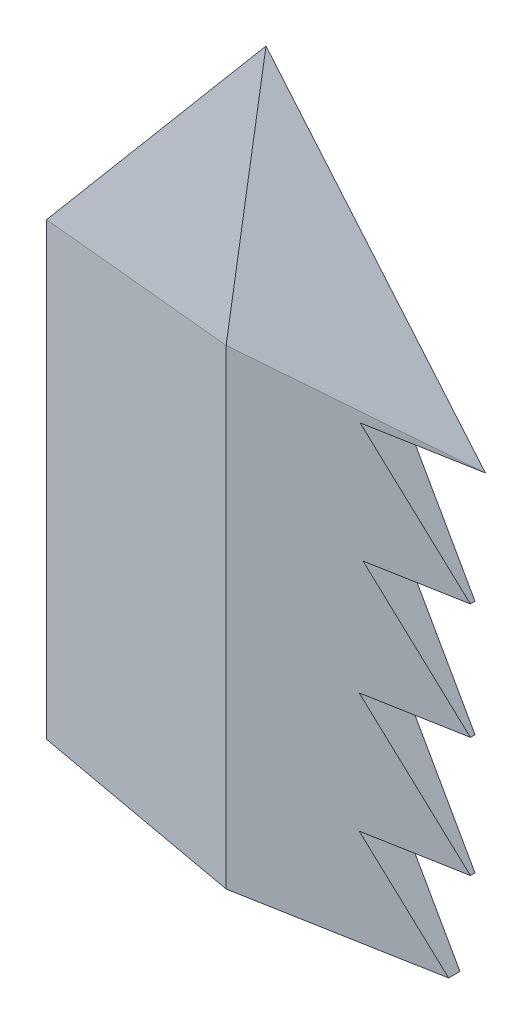
ISO-10303-21;
HEADER;
FILE_DESCRIPTION(('STEP AP214'),'2;1');
FILE_NAME('part.step','',(''),(''),'','','');
FILE_SCHEMA(('AUTOMOTIVE_DESIGN { 1 0 10303 214 1 1 1 1 }'));
ENDSEC;
DATA;
#1=APPLICATION_CONTEXT('core data for automotive mechanical design processes');
#2=APPLICATION_PROTOCOL_DEFINITION('international standard','automotive_design',2000,#1);
#3=PRODUCT_CONTEXT('',#1,'mechanical');
#4=PRODUCT('Part','Part','',(#3));
#5=PRODUCT_RELATED_PRODUCT_CATEGORY('part','',(#4));
#6=PRODUCT_DEFINITION_FORMATION('','',#4);
#7=PRODUCT_DEFINITION_CONTEXT('part definition',#1,'design');
#8=PRODUCT_DEFINITION('design','',#6,#7);
#9=PRODUCT_DEFINITION_SHAPE('','',#8);
#10=(LENGTH_UNIT() NAMED_UNIT(*) SI_UNIT(.MILLI.,.METRE.));
#11=(NAMED_UNIT(*) PLANE_ANGLE_UNIT() SI_UNIT($,.RADIAN.));
#12=(NAMED_UNIT(*) SI_UNIT($,.STERADIAN.) SOLID_ANGLE_UNIT());
#13=UNCERTAINTY_MEASURE_WITH_UNIT(LENGTH_MEASURE(1.E-05),#10,'distance_accuracy_value','');
#14=(GEOMETRIC_REPRESENTATION_CONTEXT(3) GLOBAL_UNCERTAINTY_ASSIGNED_CONTEXT((#13)) GLOBAL_UNIT_ASSIGNED_CONTEXT((#10,
#11,#12)) REPRESENTATION_CONTEXT('',''));
#15=CARTESIAN_POINT('',(0.,0.,0.));
#16=DIRECTION('',(0.,0.,1.));
#17=DIRECTION('',(1.,0.,0.));
#18=AXIS2_PLACEMENT_3D('',#15,#16,#17);
#19=CARTESIAN_POINT('',(49.4049114425268,735.656458749055,0.));
#20=DIRECTION('',(0.178885438199983,0.,0.983869910099907));
#21=DIRECTION('',(0.983869910099907,0.,-0.178885438199983));
#22=AXIS2_PLACEMENT_3D('',#19,#20,#21);
#23=PLANE('',#22);
#24=DIRECTION('',(0.983869910099908,0.,-0.178885438199983));
#25=VECTOR('',#24,1.);
#26=CARTESIAN_POINT('',(49.4049114425268,566.076912382089,0.));
#27=LINE('',#26,#25);
#28=CARTESIAN_POINT('',(49.4049114425268,566.076912382089,0.));
#29=VERTEX_POINT('',#28);
#30=CARTESIAN_POINT('',(101.792411442527,566.076912382089,-9.525));
#31=VERTEX_POINT('',#30);
#32=EDGE_CURVE('E141',#29,#31,#27,.T.);
#33=ORIENTED_EDGE('',*,*,#32,.F.);
#34=DIRECTION('',(0.,-1.,0.));
#35=VECTOR('',#34,1.);
#36=CARTESIAN_POINT('',(49.4049114425268,735.656458749055,0.));
#37=LINE('',#36,#35);
#38=CARTESIAN_POINT('',(49.4049114425268,673.557276223925,0.));
#39=VERTEX_POINT('',#38);
#40=EDGE_CURVE('E139',#39,#29,#37,.T.);
#41=ORIENTED_EDGE('',*,*,#40,.F.);
#42=DIRECTION('',(0.979647196162133,0.0925498026063238,-0.178117672029479));
#43=VECTOR('',#42,1.);
#44=CARTESIAN_POINT('',(55.0352055276626,674.089184658141,-1.02368983366106));
#45=LINE('',#44,#43);
#46=CARTESIAN_POINT('',(101.792411442527,678.506458749055,-9.52499999999999));
#47=VERTEX_POINT('',#46);
#48=EDGE_CURVE('E264',#39,#47,#45,.T.);
#49=ORIENTED_EDGE('',*,*,#48,.T.);
#50=DIRECTION('',(0.,-1.,0.));
#51=VECTOR('',#50,1.);
#52=CARTESIAN_POINT('',(101.792411442527,735.656458749055,-9.525));
#53=LINE('',#52,#51);
#54=EDGE_CURVE('E205',#47,#31,#53,.T.);
#55=ORIENTED_EDGE('',*,*,#54,.T.);
#56=EDGE_LOOP('',(#33,#41,#49,#55));
#57=FACE_BOUND('',#56,.T.);
#58=ADVANCED_FACE('F33',(#57),#23,.F.);
#59=CARTESIAN_POINT('',(101.792411442527,735.656458749055,-9.525));
#60=DIRECTION('',(-0.178885438199983,0.,0.983869910099907));
#61=DIRECTION('',(0.983869910099907,0.,0.178885438199983));
#62=AXIS2_PLACEMENT_3D('',#59,#60,#61);
#63=PLANE('',#62);
#64=DIRECTION('',(0.983869910099908,0.,0.178885438199983));
#65=VECTOR('',#64,1.);
#66=CARTESIAN_POINT('',(101.792411442527,566.076912382089,-9.525));
#67=LINE('',#66,#65);
#68=CARTESIAN_POINT('',(146.757210095391,566.076912382089,-1.34958206311564));
#69=VERTEX_POINT('',#68);
#70=EDGE_CURVE('E49',#31,#69,#67,.T.);
#71=ORIENTED_EDGE('',*,*,#70,.F.);
#72=ORIENTED_EDGE('',*,*,#54,.F.);
#73=DIRECTION('',(-0.979647196162133,0.092549802606325,-0.178117672029479));
#74=VECTOR('',#73,1.);
#75=CARTESIAN_POINT('',(96.6108407054998,678.995975128811,-10.4671037703685));
#76=LINE('',#75,#74);
#77=CARTESIAN_POINT('',(154.179911442527,673.557276223925,0.));
#78=VERTEX_POINT('',#77);
#79=EDGE_CURVE('E229',#78,#47,#76,.T.);
#80=ORIENTED_EDGE('',*,*,#79,.F.);
#81=DIRECTION('',(-0.983869910099908,0.,-0.178885438199983));
#82=VECTOR('',#81,1.);
#83=CARTESIAN_POINT('',(152.503511442527,673.557276223924,-0.304799999999994));
#84=LINE('',#83,#82);
#85=CARTESIAN_POINT('',(128.876006432521,673.557276223924,-4.60071000181918));
#86=VERTEX_POINT('',#85);
#87=EDGE_CURVE('E152',#78,#86,#84,.T.);
#88=ORIENTED_EDGE('',*,*,#87,.T.);
#89=DIRECTION('',(0.614220244823665,-0.781192595146374,0.111676408149757));
#90=VECTOR('',#89,1.);
#91=CARTESIAN_POINT('',(128.538230123855,673.986875139573,-4.66212387612206));
#92=LINE('',#91,#90);
#93=CARTESIAN_POINT('',(151.148766449185,645.229790529464,-0.551117271516697));
#94=VERTEX_POINT('',#93);
#95=EDGE_CURVE('E224',#86,#94,#92,.T.);
#96=ORIENTED_EDGE('',*,*,#95,.T.);
#97=DIRECTION('',(-0.983869910099908,0.,-0.178885438199983));
#98=VECTOR('',#97,1.);
#99=CARTESIAN_POINT('',(149.569363088972,645.229790529464,-0.838281518828162));
#100=LINE('',#99,#98);
#101=CARTESIAN_POINT('',(129.452026088125,645.229790529464,-4.49597915534583));
#102=VERTEX_POINT('',#101);
#103=EDGE_CURVE('E223',#94,#102,#100,.T.);
#104=ORIENTED_EDGE('',*,*,#103,.T.);
#105=DIRECTION('',(0.614220244823665,-0.781192595146374,0.111676408149757));
#106=VECTOR('',#105,1.);
#107=CARTESIAN_POINT('',(129.107065881123,645.668526246174,-4.55869919298257));
#108=LINE('',#107,#106);
#109=CARTESIAN_POINT('',(151.148766449185,617.634912223655,-0.551117271516697));
#110=VERTEX_POINT('',#109);
#111=EDGE_CURVE('E221',#102,#110,#108,.T.);
#112=ORIENTED_EDGE('',*,*,#111,.T.);
#113=DIRECTION('',(-0.983869910099908,0.,-0.178885438199983));
#114=VECTOR('',#113,1.);
#115=CARTESIAN_POINT('',(149.569363088972,617.634912223655,-0.838281518828162));
#116=LINE('',#115,#114);
#117=CARTESIAN_POINT('',(128.683999880654,617.634912223655,-4.63562028397697));
#118=VERTEX_POINT('',#117);
#119=EDGE_CURVE('E219',#110,#118,#116,.T.);
#120=ORIENTED_EDGE('',*,*,#119,.T.);
#121=DIRECTION('',(0.614220244823665,-0.781192595146374,0.111676408149757));
#122=VECTOR('',#121,1.);
#123=CARTESIAN_POINT('',(128.348618204766,618.06146553895,-4.69659877050188));
#124=LINE('',#123,#122);
#125=CARTESIAN_POINT('',(151.148766449185,589.063224066312,-0.551117271516697));
#126=VERTEX_POINT('',#125);
#127=EDGE_CURVE('E217',#118,#126,#124,.T.);
#128=ORIENTED_EDGE('',*,*,#127,.T.);
#129=DIRECTION('',(-0.983869910099908,0.,-0.178885438199983));
#130=VECTOR('',#129,1.);
#131=CARTESIAN_POINT('',(149.569363088972,589.063224066312,-0.838281518828162));
#132=LINE('',#131,#130);
#133=CARTESIAN_POINT('',(128.683999880654,589.063224066312,-4.63562028397697));
#134=VERTEX_POINT('',#133);
#135=EDGE_CURVE('E215',#126,#134,#132,.T.);
#136=ORIENTED_EDGE('',*,*,#135,.T.);
#137=DIRECTION('',(0.614220244823665,-0.781192595146374,0.111676408149757));
#138=VECTOR('',#137,1.);
#139=CARTESIAN_POINT('',(128.348618204766,589.489777381607,-4.69659877050188));
#140=LINE('',#139,#138);
#141=EDGE_CURVE('E208',#134,#69,#140,.T.);
#142=ORIENTED_EDGE('',*,*,#141,.T.);
#143=EDGE_LOOP('',(#71,#72,#80,#88,#96,#104,#112,#120,#128,#136,#142));
#144=FACE_BOUND('',#143,.T.);
#145=ADVANCED_FACE('F227',(#144),#63,.F.);
#146=CARTESIAN_POINT('',(101.792411442527,735.656458749055,9.525));
#147=DIRECTION('',(-0.178885438199983,0.,-0.983869910099907));
#148=DIRECTION('',(-0.983869910099907,0.,0.178885438199983));
#149=AXIS2_PLACEMENT_3D('',#146,#147,#148);
#150=PLANE('',#149);
#151=DIRECTION('',(-0.983869910099908,0.,0.178885438199983));
#152=VECTOR('',#151,1.);
#153=CARTESIAN_POINT('',(101.792411442527,566.076912382089,9.525));
#154=LINE('',#153,#152);
#155=CARTESIAN_POINT('',(146.757210095391,566.076912382089,1.34958206311564));
#156=VERTEX_POINT('',#155);
#157=CARTESIAN_POINT('',(101.792411442527,566.076912382089,9.525));
#158=VERTEX_POINT('',#157);
#159=EDGE_CURVE('E122',#156,#158,#154,.T.);
#160=ORIENTED_EDGE('',*,*,#159,.F.);
#161=DIRECTION('',(-0.614220244823665,0.781192595146374,0.111676408149757));
#162=VECTOR('',#161,1.);
#163=CARTESIAN_POINT('',(129.655332204645,587.827840463568,4.45901440688762));
#164=LINE('',#163,#162);
#165=CARTESIAN_POINT('',(128.683999880654,589.063224066312,4.63562028397696));
#166=VERTEX_POINT('',#165);
#167=EDGE_CURVE('E148',#156,#166,#164,.T.);
#168=ORIENTED_EDGE('',*,*,#167,.T.);
#169=DIRECTION('',(0.983869910099908,0.,-0.178885438199983));
#170=VECTOR('',#169,1.);
#171=CARTESIAN_POINT('',(152.922163088972,589.063224066312,0.228681518828154));
#172=LINE('',#171,#170);
#173=CARTESIAN_POINT('',(151.148766449185,589.063224066312,0.551117271516686));
#174=VERTEX_POINT('',#173);
#175=EDGE_CURVE('E150',#166,#174,#172,.T.);
#176=ORIENTED_EDGE('',*,*,#175,.T.);
#177=DIRECTION('',(-0.614220244823665,0.781192595146374,0.111676408149757));
#178=VECTOR('',#177,1.);
#179=CARTESIAN_POINT('',(129.655332204645,616.399528620911,4.45901440688762));
#180=LINE('',#179,#178);
#181=CARTESIAN_POINT('',(128.683999880653,617.634912223655,4.63562028397696));
#182=VERTEX_POINT('',#181);
#183=EDGE_CURVE('E159',#174,#182,#180,.T.);
#184=ORIENTED_EDGE('',*,*,#183,.T.);
#185=DIRECTION('',(0.983869910099908,0.,-0.178885438199983));
#186=VECTOR('',#185,1.);
#187=CARTESIAN_POINT('',(152.922163088972,617.634912223655,0.228681518828154));
#188=LINE('',#187,#186);
#189=CARTESIAN_POINT('',(151.148766449185,617.634912223655,0.551117271516686));
#190=VERTEX_POINT('',#189);
#191=EDGE_CURVE('E162',#182,#190,#188,.T.);
#192=ORIENTED_EDGE('',*,*,#191,.T.);
#193=DIRECTION('',(-0.614220244823665,0.781192595146374,0.111676408149757));
#194=VECTOR('',#193,1.);
#195=CARTESIAN_POINT('',(130.413779881001,644.006589328136,4.32111482936831));
#196=LINE('',#195,#194);
#197=CARTESIAN_POINT('',(129.452026088125,645.229790529464,4.49597915534583));
#198=VERTEX_POINT('',#197);
#199=EDGE_CURVE('E165',#190,#198,#196,.T.);
#200=ORIENTED_EDGE('',*,*,#199,.T.);
#201=DIRECTION('',(0.983869910099908,0.,-0.178885438199983));
#202=VECTOR('',#201,1.);
#203=CARTESIAN_POINT('',(152.922163088972,645.229790529464,0.228681518828154));
#204=LINE('',#203,#202);
#205=CARTESIAN_POINT('',(151.148766449185,645.229790529464,0.551117271516686));
#206=VERTEX_POINT('',#205);
#207=EDGE_CURVE('E168',#198,#206,#204,.T.);
#208=ORIENTED_EDGE('',*,*,#207,.T.);
#209=DIRECTION('',(-0.614220244823665,0.781192595146374,0.111676408149757));
#210=VECTOR('',#209,1.);
#211=CARTESIAN_POINT('',(129.844944123734,672.324938221534,4.4245395125078));
#212=LINE('',#211,#210);
#213=CARTESIAN_POINT('',(128.876006432521,673.557276223924,4.60071000181918));
#214=VERTEX_POINT('',#213);
#215=EDGE_CURVE('E171',#206,#214,#212,.T.);
#216=ORIENTED_EDGE('',*,*,#215,.T.);
#217=DIRECTION('',(0.983869910099908,0.,-0.178885438199983));
#218=VECTOR('',#217,1.);
#219=CARTESIAN_POINT('',(155.856311442527,673.557276223924,-0.304800000000015));
#220=LINE('',#219,#218);
#221=EDGE_CURVE('E173',#214,#78,#220,.T.);
#222=ORIENTED_EDGE('',*,*,#221,.T.);
#223=DIRECTION('',(0.979647196162133,-0.0925498026063245,-0.178117672029479));
#224=VECTOR('',#223,1.);
#225=CARTESIAN_POINT('',(96.6108407054998,678.995975128811,10.4671037703685));
#226=LINE('',#225,#224);
#227=CARTESIAN_POINT('',(101.792411442527,678.506458749055,9.525));
#228=VERTEX_POINT('',#227);
#229=EDGE_CURVE('E147',#228,#78,#226,.T.);
#230=ORIENTED_EDGE('',*,*,#229,.F.);
#231=DIRECTION('',(0.,-1.,0.));
#232=VECTOR('',#231,1.);
#233=CARTESIAN_POINT('',(101.792411442527,735.656458749055,9.525));
#234=LINE('',#233,#232);
#235=EDGE_CURVE('E137',#228,#158,#234,.T.);
#236=ORIENTED_EDGE('',*,*,#235,.T.);
#237=EDGE_LOOP('',(#160,#168,#176,#184,#192,#200,#208,#216,#222,#230,#236));
#238=FACE_BOUND('',#237,.T.);
#239=ADVANCED_FACE('F144',(#238),#150,.F.);
#240=CARTESIAN_POINT('',(49.4049114425268,735.656458749055,0.));
#241=DIRECTION('',(0.178885438199983,0.,-0.983869910099907));
#242=DIRECTION('',(-0.983869910099907,0.,-0.178885438199983));
#243=AXIS2_PLACEMENT_3D('',#240,#241,#242);
#244=PLANE('',#243);
#245=DIRECTION('',(-0.983869910099908,0.,-0.178885438199983));
#246=VECTOR('',#245,1.);
#247=CARTESIAN_POINT('',(49.4049114425268,566.076912382089,0.));
#248=LINE('',#247,#246);
#249=EDGE_CURVE('E125',#158,#29,#248,.T.);
#250=ORIENTED_EDGE('',*,*,#249,.F.);
#251=ORIENTED_EDGE('',*,*,#235,.F.);
#252=DIRECTION('',(-0.979647196162133,-0.0925498026063228,-0.178117672029479));
#253=VECTOR('',#252,1.);
#254=CARTESIAN_POINT('',(55.0352055276626,674.089184658141,1.02368983366104));
#255=LINE('',#254,#253);
#256=EDGE_CURVE('E196',#228,#39,#255,.T.);
#257=ORIENTED_EDGE('',*,*,#256,.T.);
#258=ORIENTED_EDGE('',*,*,#40,.T.);
#259=EDGE_LOOP('',(#250,#251,#257,#258));
#260=FACE_BOUND('',#259,.T.);
#261=ADVANCED_FACE('F135',(#260),#244,.F.);
#262=CARTESIAN_POINT('',(128.683999880654,589.063224066312,-9.525));
#263=DIRECTION('',(0.786110007979643,0.618086608295509,0.));
#264=DIRECTION('',(-0.618086608295509,0.786110007979643,0.));
#265=AXIS2_PLACEMENT_3D('',#262,#263,#264);
#266=PLANE('',#265);
#267=ORIENTED_EDGE('',*,*,#167,.F.);
#268=DIRECTION('',(0.,0.,-1.));
#269=VECTOR('',#268,1.);
#270=CARTESIAN_POINT('',(146.757210095391,566.076912382089,-9.525));
#271=LINE('',#270,#269);
#272=EDGE_CURVE('E127',#156,#69,#271,.T.);
#273=ORIENTED_EDGE('',*,*,#272,.T.);
#274=ORIENTED_EDGE('',*,*,#141,.F.);
#275=DIRECTION('',(0.,0.,1.));
#276=VECTOR('',#275,1.);
#277=CARTESIAN_POINT('',(128.683999880654,589.063224066312,-9.525));
#278=LINE('',#277,#276);
#279=EDGE_CURVE('E175',#134,#166,#278,.T.);
#280=ORIENTED_EDGE('',*,*,#279,.T.);
#281=EDGE_LOOP('',(#267,#273,#274,#280));
#282=FACE_BOUND('',#281,.T.);
#283=ADVANCED_FACE('F35',(#282),#266,.T.);
#284=CARTESIAN_POINT('',(154.179911442527,673.557276223924,-9.525));
#285=DIRECTION('',(0.,-1.,0.));
#286=DIRECTION('',(0.,0.,-1.));
#287=AXIS2_PLACEMENT_3D('',#284,#285,#286);
#288=PLANE('',#287);
#289=ORIENTED_EDGE('',*,*,#87,.F.);
#290=ORIENTED_EDGE('',*,*,#221,.F.);
#291=DIRECTION('',(0.,0.,1.));
#292=VECTOR('',#291,1.);
#293=CARTESIAN_POINT('',(128.876006432521,673.557276223924,-9.525));
#294=LINE('',#293,#292);
#295=EDGE_CURVE('E57',#86,#214,#294,.T.);
#296=ORIENTED_EDGE('',*,*,#295,.F.);
#297=EDGE_LOOP('',(#289,#290,#296));
#298=FACE_BOUND('',#297,.T.);
#299=ADVANCED_FACE('F234',(#298),#288,.T.);
#300=CARTESIAN_POINT('',(128.876006432521,673.557276223924,-9.525));
#301=DIRECTION('',(0.786110007979643,0.618086608295509,0.));
#302=DIRECTION('',(-0.618086608295509,0.786110007979643,0.));
#303=AXIS2_PLACEMENT_3D('',#300,#301,#302);
#304=PLANE('',#303);
#305=ORIENTED_EDGE('',*,*,#95,.F.);
#306=ORIENTED_EDGE('',*,*,#295,.T.);
#307=ORIENTED_EDGE('',*,*,#215,.F.);
#308=DIRECTION('',(0.,0.,1.));
#309=VECTOR('',#308,1.);
#310=CARTESIAN_POINT('',(151.148766449185,645.229790529464,-9.525));
#311=LINE('',#310,#309);
#312=EDGE_CURVE('E177',#94,#206,#311,.T.);
#313=ORIENTED_EDGE('',*,*,#312,.F.);
#314=EDGE_LOOP('',(#305,#306,#307,#313));
#315=FACE_BOUND('',#314,.T.);
#316=ADVANCED_FACE('F233',(#315),#304,.T.);
#317=CARTESIAN_POINT('',(151.148766449185,645.229790529464,-9.525));
#318=DIRECTION('',(0.,-1.,0.));
#319=DIRECTION('',(0.,0.,-1.));
#320=AXIS2_PLACEMENT_3D('',#317,#318,#319);
#321=PLANE('',#320);
#322=ORIENTED_EDGE('',*,*,#103,.F.);
#323=ORIENTED_EDGE('',*,*,#312,.T.);
#324=ORIENTED_EDGE('',*,*,#207,.F.);
#325=DIRECTION('',(0.,0.,1.));
#326=VECTOR('',#325,1.);
#327=CARTESIAN_POINT('',(129.452026088125,645.229790529464,-9.525));
#328=LINE('',#327,#326);
#329=EDGE_CURVE('E179',#102,#198,#328,.T.);
#330=ORIENTED_EDGE('',*,*,#329,.F.);
#331=EDGE_LOOP('',(#322,#323,#324,#330));
#332=FACE_BOUND('',#331,.T.);
#333=ADVANCED_FACE('F239',(#332),#321,.T.);
#334=CARTESIAN_POINT('',(129.452026088125,645.229790529464,-9.525));
#335=DIRECTION('',(0.786110007979643,0.61808660829551,0.));
#336=DIRECTION('',(-0.61808660829551,0.786110007979642,0.));
#337=AXIS2_PLACEMENT_3D('',#334,#335,#336);
#338=PLANE('',#337);
#339=ORIENTED_EDGE('',*,*,#111,.F.);
#340=ORIENTED_EDGE('',*,*,#329,.T.);
#341=ORIENTED_EDGE('',*,*,#199,.F.);
#342=DIRECTION('',(0.,0.,1.));
#343=VECTOR('',#342,1.);
#344=CARTESIAN_POINT('',(151.148766449185,617.634912223655,-9.525));
#345=LINE('',#344,#343);
#346=EDGE_CURVE('E181',#110,#190,#345,.T.);
#347=ORIENTED_EDGE('',*,*,#346,.F.);
#348=EDGE_LOOP('',(#339,#340,#341,#347));
#349=FACE_BOUND('',#348,.T.);
#350=ADVANCED_FACE('F244',(#349),#338,.T.);
#351=CARTESIAN_POINT('',(151.148766449185,617.634912223655,-9.525));
#352=DIRECTION('',(0.,-1.,0.));
#353=DIRECTION('',(0.,0.,-1.));
#354=AXIS2_PLACEMENT_3D('',#351,#352,#353);
#355=PLANE('',#354);
#356=ORIENTED_EDGE('',*,*,#119,.F.);
#357=ORIENTED_EDGE('',*,*,#346,.T.);
#358=ORIENTED_EDGE('',*,*,#191,.F.);
#359=DIRECTION('',(0.,0.,1.));
#360=VECTOR('',#359,1.);
#361=CARTESIAN_POINT('',(128.683999880654,617.634912223655,-9.525));
#362=LINE('',#361,#360);
#363=EDGE_CURVE('E183',#118,#182,#362,.T.);
#364=ORIENTED_EDGE('',*,*,#363,.F.);
#365=EDGE_LOOP('',(#356,#357,#358,#364));
#366=FACE_BOUND('',#365,.T.);
#367=ADVANCED_FACE('F247',(#366),#355,.T.);
#368=CARTESIAN_POINT('',(128.683999880654,617.634912223655,-9.525));
#369=DIRECTION('',(0.786110007979642,0.61808660829551,0.));
#370=DIRECTION('',(-0.61808660829551,0.786110007979642,0.));
#371=AXIS2_PLACEMENT_3D('',#368,#369,#370);
#372=PLANE('',#371);
#373=ORIENTED_EDGE('',*,*,#127,.F.);
#374=ORIENTED_EDGE('',*,*,#363,.T.);
#375=ORIENTED_EDGE('',*,*,#183,.F.);
#376=DIRECTION('',(0.,0.,1.));
#377=VECTOR('',#376,1.);
#378=CARTESIAN_POINT('',(151.148766449185,589.063224066312,-9.525));
#379=LINE('',#378,#377);
#380=EDGE_CURVE('E185',#126,#174,#379,.T.);
#381=ORIENTED_EDGE('',*,*,#380,.F.);
#382=EDGE_LOOP('',(#373,#374,#375,#381));
#383=FACE_BOUND('',#382,.T.);
#384=ADVANCED_FACE('F254',(#383),#372,.T.);
#385=CARTESIAN_POINT('',(151.148766449185,589.063224066312,-9.525));
#386=DIRECTION('',(0.,-1.,0.));
#387=DIRECTION('',(0.,0.,-1.));
#388=AXIS2_PLACEMENT_3D('',#385,#386,#387);
#389=PLANE('',#388);
#390=ORIENTED_EDGE('',*,*,#135,.F.);
#391=ORIENTED_EDGE('',*,*,#380,.T.);
#392=ORIENTED_EDGE('',*,*,#175,.F.);
#393=ORIENTED_EDGE('',*,*,#279,.F.);
#394=EDGE_LOOP('',(#390,#391,#392,#393));
#395=FACE_BOUND('',#394,.T.);
#396=ADVANCED_FACE('F259',(#395),#389,.T.);
#397=CARTESIAN_POINT('',(26.4304595608884,22.2970036632238,133.782021979343));
#398=DIRECTION('',(0.191277369739479,0.161363528467896,0.968181170807374));
#399=DIRECTION('',(0.98103763388137,0.,-0.193817339029417));
#400=AXIS2_PLACEMENT_3D('',#397,#398,#399);
#401=PLANE('',#400);
#402=DIRECTION('',(0.,0.986393923832144,-0.164398987305356));
#403=VECTOR('',#402,1.);
#404=CARTESIAN_POINT('',(101.79241144253,19.882606993218,119.295641959305));
#405=LINE('',#404,#403);
#406=CARTESIAN_POINT('',(101.792411442527,735.656458749055,1.66533453693773E-13));
#407=VERTEX_POINT('',#406);
#408=EDGE_CURVE('E42',#228,#407,#405,.T.);
#409=ORIENTED_EDGE('',*,*,#408,.F.);
#410=ORIENTED_EDGE('',*,*,#229,.T.);
#411=DIRECTION('',(0.644808491187796,-0.764344169659269,0.));
#412=VECTOR('',#411,1.);
#413=CARTESIAN_POINT('',(154.179911442527,673.557276223924,0.));
#414=LINE('',#413,#412);
#415=EDGE_CURVE('E198',#407,#78,#414,.T.);
#416=ORIENTED_EDGE('',*,*,#415,.F.);
#417=EDGE_LOOP('',(#409,#410,#416));
#418=FACE_BOUND('',#417,.T.);
#419=ADVANCED_FACE('F199',(#418),#401,.T.);
#420=CARTESIAN_POINT('',(-18.9818950957623,16.0133191596654,96.0799149579938));
#421=DIRECTION('',(0.191277369739479,-0.161363528467894,-0.968181170807374));
#422=DIRECTION('',(-0.98103763388137,0.,-0.193817339029416));
#423=AXIS2_PLACEMENT_3D('',#420,#421,#422);
#424=PLANE('',#423);
#425=DIRECTION('',(-0.644808491187796,-0.764344169659269,0.));
#426=VECTOR('',#425,1.);
#427=CARTESIAN_POINT('',(101.792411442527,735.656458749055,2.30718222304915E-13));
#428=LINE('',#427,#426);
#429=EDGE_CURVE('E195',#407,#39,#428,.T.);
#430=ORIENTED_EDGE('',*,*,#429,.T.);
#431=ORIENTED_EDGE('',*,*,#256,.F.);
#432=ORIENTED_EDGE('',*,*,#408,.T.);
#433=EDGE_LOOP('',(#430,#431,#432));
#434=FACE_BOUND('',#433,.T.);
#435=ADVANCED_FACE('F194',(#434),#424,.F.);
#436=CARTESIAN_POINT('',(26.4304595608884,22.2970036632238,-133.782021979343));
#437=DIRECTION('',(0.191277369739479,0.161363528467896,-0.968181170807374));
#438=DIRECTION('',(0.98103763388137,0.,0.193817339029417));
#439=AXIS2_PLACEMENT_3D('',#436,#437,#438);
#440=PLANE('',#439);
#441=DIRECTION('',(0.,-0.986393923832144,-0.164398987305356));
#442=VECTOR('',#441,1.);
#443=CARTESIAN_POINT('',(101.79241144253,19.882606993218,-119.295641959305));
#444=LINE('',#443,#442);
#445=EDGE_CURVE('E11',#407,#47,#444,.T.);
#446=ORIENTED_EDGE('',*,*,#445,.F.);
#447=ORIENTED_EDGE('',*,*,#415,.T.);
#448=ORIENTED_EDGE('',*,*,#79,.T.);
#449=EDGE_LOOP('',(#446,#447,#448));
#450=FACE_BOUND('',#449,.T.);
#451=ADVANCED_FACE('F267',(#450),#440,.T.);
#452=CARTESIAN_POINT('',(-18.9818950957623,16.0133191596654,-96.0799149579938));
#453=DIRECTION('',(0.191277369739479,-0.161363528467894,0.968181170807374));
#454=DIRECTION('',(-0.98103763388137,0.,0.193817339029416));
#455=AXIS2_PLACEMENT_3D('',#452,#453,#454);
#456=PLANE('',#455);
#457=ORIENTED_EDGE('',*,*,#429,.F.);
#458=ORIENTED_EDGE('',*,*,#445,.T.);
#459=ORIENTED_EDGE('',*,*,#48,.F.);
#460=EDGE_LOOP('',(#457,#458,#459));
#461=FACE_BOUND('',#460,.T.);
#462=ADVANCED_FACE('F300',(#461),#456,.F.);
#463=CARTESIAN_POINT('',(0.,566.076912382089,-9.525));
#464=DIRECTION('',(0.,-1.,0.));
#465=DIRECTION('',(0.,0.,-1.));
#466=AXIS2_PLACEMENT_3D('',#463,#464,#465);
#467=PLANE('',#466);
#468=CARTESIAN_POINT('',(114.492411442527,566.076912382089,0.));
#469=DIRECTION('',(0.,-1.,0.));
#470=DIRECTION('',(0.,0.,-1.));
#471=AXIS2_PLACEMENT_3D('',#468,#469,#470);
#472=CIRCLE('',#471,1.5875);
#473=CARTESIAN_POINT('',(114.492411442527,566.076912382089,-1.5875));
#474=VERTEX_POINT('',#473);
#475=EDGE_CURVE('E282',#474,#474,#472,.T.);
#476=ORIENTED_EDGE('',*,*,#475,.F.);
#477=EDGE_LOOP('',(#476));
#478=FACE_BOUND('',#477,.T.);
#479=CARTESIAN_POINT('',(89.0924114425268,566.076912382089,0.));
#480=DIRECTION('',(0.,-1.,0.));
#481=DIRECTION('',(0.,0.,-1.));
#482=AXIS2_PLACEMENT_3D('',#479,#480,#481);
#483=CIRCLE('',#482,1.5875);
#484=CARTESIAN_POINT('',(89.0924114425268,566.076912382089,-1.5875));
#485=VERTEX_POINT('',#484);
#486=EDGE_CURVE('E275',#485,#485,#483,.T.);
#487=ORIENTED_EDGE('',*,*,#486,.F.);
#488=EDGE_LOOP('',(#487));
#489=FACE_BOUND('',#488,.T.);
#490=CARTESIAN_POINT('',(101.792411442527,566.076912382089,0.));
#491=DIRECTION('',(0.,-1.,0.));
#492=DIRECTION('',(0.,0.,-1.));
#493=AXIS2_PLACEMENT_3D('',#490,#491,#492);
#494=CIRCLE('',#493,4.7625);
#495=CARTESIAN_POINT('',(101.792411442527,566.076912382089,-4.7625));
#496=VERTEX_POINT('',#495);
#497=EDGE_CURVE('E37',#496,#496,#494,.F.);
#498=ORIENTED_EDGE('',*,*,#497,.T.);
#499=EDGE_LOOP('',(#498));
#500=FACE_BOUND('',#499,.T.);
#501=ORIENTED_EDGE('',*,*,#249,.T.);
#502=ORIENTED_EDGE('',*,*,#32,.T.);
#503=ORIENTED_EDGE('',*,*,#70,.T.);
#504=ORIENTED_EDGE('',*,*,#272,.F.);
#505=ORIENTED_EDGE('',*,*,#159,.T.);
#506=EDGE_LOOP('',(#501,#502,#503,#504,#505));
#507=FACE_BOUND('',#506,.T.);
#508=ADVANCED_FACE('F124',(#478,#489,#500,#507),#467,.T.);
#509=CARTESIAN_POINT('',(101.792411442527,650.497366015123,0.));
#510=DIRECTION('',(0.,-1.,0.));
#511=DIRECTION('',(0.,0.,-1.));
#512=AXIS2_PLACEMENT_3D('',#509,#510,#511);
#513=PLANE('',#512);
#514=CARTESIAN_POINT('',(101.792411442527,650.497366015123,0.));
#515=DIRECTION('',(0.,-1.,0.));
#516=DIRECTION('',(0.,0.,-1.));
#517=AXIS2_PLACEMENT_3D('',#514,#515,#516);
#518=CIRCLE('',#517,4.7625);
#519=CARTESIAN_POINT('',(101.792411442527,650.497366015123,-4.7625));
#520=VERTEX_POINT('',#519);
#521=EDGE_CURVE('E140',#520,#520,#518,.T.);
#522=ORIENTED_EDGE('',*,*,#521,.T.);
#523=EDGE_LOOP('',(#522));
#524=FACE_BOUND('',#523,.T.);
#525=ADVANCED_FACE('F299',(#524),#513,.T.);
#526=CARTESIAN_POINT('',(101.792411442527,650.497366015123,0.));
#527=DIRECTION('',(0.,-1.,0.));
#528=DIRECTION('',(0.,0.,-1.));
#529=AXIS2_PLACEMENT_3D('',#526,#527,#528);
#530=CYLINDRICAL_SURFACE('',#529,4.7625);
#531=ORIENTED_EDGE('',*,*,#521,.F.);
#532=EDGE_LOOP('',(#531));
#533=FACE_BOUND('',#532,.T.);
#534=ORIENTED_EDGE('',*,*,#497,.F.);
#535=EDGE_LOOP('',(#534));
#536=FACE_BOUND('',#535,.T.);
#537=ADVANCED_FACE('F307',(#533,#536),#530,.F.);
#538=CARTESIAN_POINT('',(89.0924114425268,578.776912382089,0.));
#539=DIRECTION('',(0.,-1.,0.));
#540=DIRECTION('',(0.,0.,-1.));
#541=AXIS2_PLACEMENT_3D('',#538,#539,#540);
#542=CYLINDRICAL_SURFACE('',#541,1.5875);
#543=CARTESIAN_POINT('',(89.0924114425268,578.776912382089,0.));
#544=DIRECTION('',(0.,-1.,0.));
#545=DIRECTION('',(0.,0.,-1.));
#546=AXIS2_PLACEMENT_3D('',#543,#544,#545);
#547=CIRCLE('',#546,1.5875);
#548=CARTESIAN_POINT('',(89.0924114425268,578.776912382089,-1.5875));
#549=VERTEX_POINT('',#548);
#550=EDGE_CURVE('E278',#549,#549,#547,.T.);
#551=ORIENTED_EDGE('',*,*,#550,.F.);
#552=EDGE_LOOP('',(#551));
#553=FACE_BOUND('',#552,.T.);
#554=ORIENTED_EDGE('',*,*,#486,.T.);
#555=EDGE_LOOP('',(#554));
#556=FACE_BOUND('',#555,.T.);
#557=ADVANCED_FACE('F309',(#553,#556),#542,.F.);
#558=CARTESIAN_POINT('',(89.0924114425268,578.776912382089,0.));
#559=DIRECTION('',(0.,-1.,0.));
#560=DIRECTION('',(0.,0.,-1.));
#561=AXIS2_PLACEMENT_3D('',#558,#559,#560);
#562=PLANE('',#561);
#563=ORIENTED_EDGE('',*,*,#550,.T.);
#564=EDGE_LOOP('',(#563));
#565=FACE_BOUND('',#564,.T.);
#566=ADVANCED_FACE('F293',(#565),#562,.T.);
#567=CARTESIAN_POINT('',(114.492411442527,578.776912382089,0.));
#568=DIRECTION('',(0.,-1.,0.));
#569=DIRECTION('',(0.,0.,-1.));
#570=AXIS2_PLACEMENT_3D('',#567,#568,#569);
#571=CYLINDRICAL_SURFACE('',#570,1.5875);
#572=CARTESIAN_POINT('',(114.492411442527,578.776912382089,0.));
#573=DIRECTION('',(0.,-1.,0.));
#574=DIRECTION('',(0.,0.,-1.));
#575=AXIS2_PLACEMENT_3D('',#572,#573,#574);
#576=CIRCLE('',#575,1.5875);
#577=CARTESIAN_POINT('',(114.492411442527,578.776912382089,-1.5875));
#578=VERTEX_POINT('',#577);
#579=EDGE_CURVE('E279',#578,#578,#576,.T.);
#580=ORIENTED_EDGE('',*,*,#579,.F.);
#581=EDGE_LOOP('',(#580));
#582=FACE_BOUND('',#581,.T.);
#583=ORIENTED_EDGE('',*,*,#475,.T.);
#584=EDGE_LOOP('',(#583));
#585=FACE_BOUND('',#584,.T.);
#586=ADVANCED_FACE('F290',(#582,#585),#571,.F.);
#587=CARTESIAN_POINT('',(114.492411442527,578.776912382089,0.));
#588=DIRECTION('',(0.,-1.,0.));
#589=DIRECTION('',(0.,0.,-1.));
#590=AXIS2_PLACEMENT_3D('',#587,#588,#589);
#591=PLANE('',#590);
#592=ORIENTED_EDGE('',*,*,#579,.T.);
#593=EDGE_LOOP('',(#592));
#594=FACE_BOUND('',#593,.T.);
#595=ADVANCED_FACE('F288',(#594),#591,.T.);
#596=CLOSED_SHELL('',(#58,#145,#239,#261,#283,#299,#316,#333,#350,#367,#384,#396,#419,#435,#451,
#462,#508,#525,#537,#557,#566,#586,#595));
#597=MANIFOLD_SOLID_BREP('B2',#596);
#598=ADVANCED_BREP_SHAPE_REPRESENTATION('',(#18,#597),#14);
#599=SHAPE_DEFINITION_REPRESENTATION(#9,#598);
ENDSEC;
END-ISO-10303-21;
